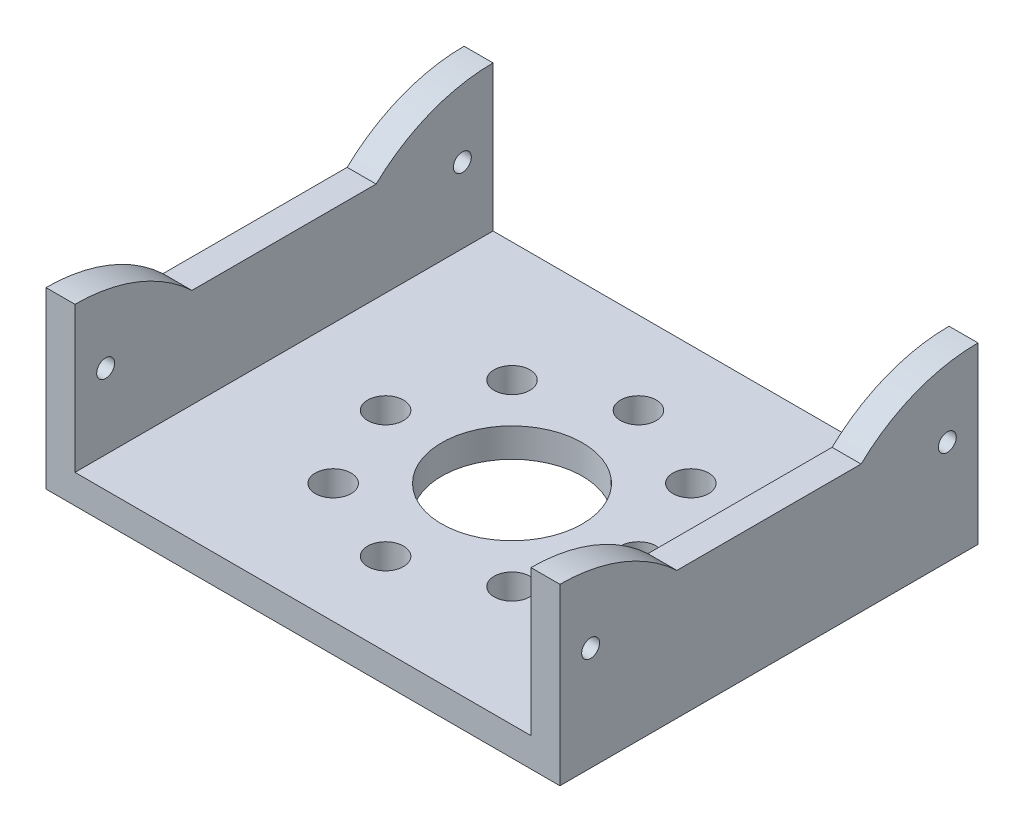
ISO-10303-21;
HEADER;
FILE_DESCRIPTION(('STEP AP214'),'2;1');
FILE_NAME('part.step','',(''),(''),'','','');
FILE_SCHEMA(('AUTOMOTIVE_DESIGN { 1 0 10303 214 1 1 1 1 }'));
ENDSEC;
DATA;
#1=APPLICATION_CONTEXT('core data for automotive mechanical design processes');
#2=APPLICATION_PROTOCOL_DEFINITION('international standard','automotive_design',2000,#1);
#3=PRODUCT_CONTEXT('',#1,'mechanical');
#4=PRODUCT('Part','Part','',(#3));
#5=PRODUCT_RELATED_PRODUCT_CATEGORY('part','',(#4));
#6=PRODUCT_DEFINITION_FORMATION('','',#4);
#7=PRODUCT_DEFINITION_CONTEXT('part definition',#1,'design');
#8=PRODUCT_DEFINITION('design','',#6,#7);
#9=PRODUCT_DEFINITION_SHAPE('','',#8);
#10=(LENGTH_UNIT() NAMED_UNIT(*) SI_UNIT(.MILLI.,.METRE.));
#11=(NAMED_UNIT(*) PLANE_ANGLE_UNIT() SI_UNIT($,.RADIAN.));
#12=(NAMED_UNIT(*) SI_UNIT($,.STERADIAN.) SOLID_ANGLE_UNIT());
#13=UNCERTAINTY_MEASURE_WITH_UNIT(LENGTH_MEASURE(1.E-05),#10,'distance_accuracy_value','');
#14=(GEOMETRIC_REPRESENTATION_CONTEXT(3) GLOBAL_UNCERTAINTY_ASSIGNED_CONTEXT((#13)) GLOBAL_UNIT_ASSIGNED_CONTEXT((#10,
#11,#12)) REPRESENTATION_CONTEXT('',''));
#15=CARTESIAN_POINT('',(0.,0.,0.));
#16=DIRECTION('',(0.,0.,1.));
#17=DIRECTION('',(1.,0.,0.));
#18=AXIS2_PLACEMENT_3D('',#15,#16,#17);
#19=CARTESIAN_POINT('',(14.37,0.,23.38));
#20=DIRECTION('',(1.,0.,0.));
#21=DIRECTION('',(0.,0.,-1.));
#22=AXIS2_PLACEMENT_3D('',#19,#20,#21);
#23=PLANE('',#22);
#24=CARTESIAN_POINT('',(14.37,5.81,1.715));
#25=DIRECTION('',(-1.,0.,0.));
#26=DIRECTION('',(0.,0.,1.));
#27=AXIS2_PLACEMENT_3D('',#24,#25,#26);
#28=CIRCLE('',#27,0.499999999999999);
#29=CARTESIAN_POINT('',(14.37,5.81,2.215));
#30=VERTEX_POINT('',#29);
#31=EDGE_CURVE('E267',#30,#30,#28,.T.);
#32=ORIENTED_EDGE('',*,*,#31,.T.);
#33=EDGE_LOOP('',(#32));
#34=FACE_BOUND('',#33,.T.);
#35=CARTESIAN_POINT('',(14.37,5.81,21.665));
#36=DIRECTION('',(-1.,0.,0.));
#37=DIRECTION('',(0.,0.,1.));
#38=AXIS2_PLACEMENT_3D('',#35,#36,#37);
#39=CIRCLE('',#38,0.499999999999992);
#40=CARTESIAN_POINT('',(14.37,5.81,22.165));
#41=VERTEX_POINT('',#40);
#42=EDGE_CURVE('E268',#41,#41,#39,.T.);
#43=ORIENTED_EDGE('',*,*,#42,.T.);
#44=EDGE_LOOP('',(#43));
#45=FACE_BOUND('',#44,.T.);
#46=DIRECTION('',(0.,-1.,0.));
#47=VECTOR('',#46,1.);
#48=CARTESIAN_POINT('',(14.37,0.,0.));
#49=LINE('',#48,#47);
#50=CARTESIAN_POINT('',(14.37,9.76,0.));
#51=VERTEX_POINT('',#50);
#52=CARTESIAN_POINT('',(14.37,0.,0.));
#53=VERTEX_POINT('',#52);
#54=EDGE_CURVE('E102',#51,#53,#49,.T.);
#55=ORIENTED_EDGE('',*,*,#54,.F.);
#56=CARTESIAN_POINT('',(14.37,0.225350969005863,0.));
#57=DIRECTION('',(1.,0.,0.));
#58=DIRECTION('',(0.,0.,-1.));
#59=AXIS2_PLACEMENT_3D('',#56,#57,#58);
#60=CIRCLE('',#59,9.53464903099414);
#61=CARTESIAN_POINT('',(14.37,7.16355586148349,6.5399422791212));
#62=VERTEX_POINT('',#61);
#63=EDGE_CURVE('E254',#51,#62,#60,.T.);
#64=ORIENTED_EDGE('',*,*,#63,.T.);
#65=DIRECTION('',(0.,0.,1.));
#66=VECTOR('',#65,1.);
#67=CARTESIAN_POINT('',(14.37,7.16355586148349,6.5399422791212));
#68=LINE('',#67,#66);
#69=CARTESIAN_POINT('',(14.37,7.16355586148349,16.8400577208788));
#70=VERTEX_POINT('',#69);
#71=EDGE_CURVE('E133',#62,#70,#68,.T.);
#72=ORIENTED_EDGE('',*,*,#71,.T.);
#73=CARTESIAN_POINT('',(14.37,0.225350969005868,23.38));
#74=DIRECTION('',(1.,0.,0.));
#75=DIRECTION('',(0.,0.,-1.));
#76=AXIS2_PLACEMENT_3D('',#73,#74,#75);
#77=CIRCLE('',#76,9.53464903099413);
#78=CARTESIAN_POINT('',(14.37,9.76,23.38));
#79=VERTEX_POINT('',#78);
#80=EDGE_CURVE('E257',#70,#79,#77,.T.);
#81=ORIENTED_EDGE('',*,*,#80,.T.);
#82=DIRECTION('',(0.,-1.,0.));
#83=VECTOR('',#82,1.);
#84=CARTESIAN_POINT('',(14.37,0.,23.38));
#85=LINE('',#84,#83);
#86=CARTESIAN_POINT('',(14.37,0.,23.38));
#87=VERTEX_POINT('',#86);
#88=EDGE_CURVE('E144',#79,#87,#85,.T.);
#89=ORIENTED_EDGE('',*,*,#88,.T.);
#90=DIRECTION('',(0.,0.,-1.));
#91=VECTOR('',#90,1.);
#92=CARTESIAN_POINT('',(14.37,0.,23.38));
#93=LINE('',#92,#91);
#94=EDGE_CURVE('E158',#87,#53,#93,.T.);
#95=ORIENTED_EDGE('',*,*,#94,.T.);
#96=EDGE_LOOP('',(#55,#64,#72,#81,#89,#95));
#97=FACE_BOUND('',#96,.T.);
#98=ADVANCED_FACE('F32',(#34,#45,#97),#23,.T.);
#99=CARTESIAN_POINT('',(12.75,9.76,23.38));
#100=DIRECTION('',(-1.,0.,0.));
#101=DIRECTION('',(0.,-1.,0.));
#102=AXIS2_PLACEMENT_3D('',#99,#100,#101);
#103=PLANE('',#102);
#104=CARTESIAN_POINT('',(12.75,5.81,1.715));
#105=DIRECTION('',(-1.,0.,0.));
#106=DIRECTION('',(0.,-1.,0.));
#107=AXIS2_PLACEMENT_3D('',#104,#105,#106);
#108=CIRCLE('',#107,0.499999999999999);
#109=CARTESIAN_POINT('',(12.75,5.31,1.715));
#110=VERTEX_POINT('',#109);
#111=EDGE_CURVE('E258',#110,#110,#108,.F.);
#112=ORIENTED_EDGE('',*,*,#111,.T.);
#113=EDGE_LOOP('',(#112));
#114=FACE_BOUND('',#113,.T.);
#115=CARTESIAN_POINT('',(12.75,5.81,21.665));
#116=DIRECTION('',(-1.,0.,0.));
#117=DIRECTION('',(0.,-1.,0.));
#118=AXIS2_PLACEMENT_3D('',#115,#116,#117);
#119=CIRCLE('',#118,0.499999999999992);
#120=CARTESIAN_POINT('',(12.75,5.31,21.665));
#121=VERTEX_POINT('',#120);
#122=EDGE_CURVE('E264',#121,#121,#119,.F.);
#123=ORIENTED_EDGE('',*,*,#122,.T.);
#124=EDGE_LOOP('',(#123));
#125=FACE_BOUND('',#124,.T.);
#126=DIRECTION('',(0.,0.,-1.));
#127=VECTOR('',#126,1.);
#128=CARTESIAN_POINT('',(12.75,7.16355586148349,23.38));
#129=LINE('',#128,#127);
#130=CARTESIAN_POINT('',(12.75,7.16355586148349,16.8400577208788));
#131=VERTEX_POINT('',#130);
#132=CARTESIAN_POINT('',(12.75,7.16355586148349,6.5399422791212));
#133=VERTEX_POINT('',#132);
#134=EDGE_CURVE('E40',#131,#133,#129,.T.);
#135=ORIENTED_EDGE('',*,*,#134,.T.);
#136=CARTESIAN_POINT('',(12.75,0.225350969005863,0.));
#137=DIRECTION('',(-1.,0.,0.));
#138=DIRECTION('',(0.,-1.,0.));
#139=AXIS2_PLACEMENT_3D('',#136,#137,#138);
#140=CIRCLE('',#139,9.53464903099414);
#141=CARTESIAN_POINT('',(12.75,9.76,0.));
#142=VERTEX_POINT('',#141);
#143=EDGE_CURVE('E11',#133,#142,#140,.T.);
#144=ORIENTED_EDGE('',*,*,#143,.T.);
#145=DIRECTION('',(0.,1.,0.));
#146=VECTOR('',#145,1.);
#147=CARTESIAN_POINT('',(12.75,9.76,0.));
#148=LINE('',#147,#146);
#149=CARTESIAN_POINT('',(12.75,1.62,0.));
#150=VERTEX_POINT('',#149);
#151=EDGE_CURVE('E148',#150,#142,#148,.T.);
#152=ORIENTED_EDGE('',*,*,#151,.F.);
#153=DIRECTION('',(0.,0.,-1.));
#154=VECTOR('',#153,1.);
#155=CARTESIAN_POINT('',(12.75,1.62,23.38));
#156=LINE('',#155,#154);
#157=CARTESIAN_POINT('',(12.75,1.62,23.38));
#158=VERTEX_POINT('',#157);
#159=EDGE_CURVE('E152',#158,#150,#156,.T.);
#160=ORIENTED_EDGE('',*,*,#159,.F.);
#161=DIRECTION('',(0.,1.,0.));
#162=VECTOR('',#161,1.);
#163=CARTESIAN_POINT('',(12.75,9.76,23.38));
#164=LINE('',#163,#162);
#165=CARTESIAN_POINT('',(12.75,9.76,23.38));
#166=VERTEX_POINT('',#165);
#167=EDGE_CURVE('E151',#158,#166,#164,.T.);
#168=ORIENTED_EDGE('',*,*,#167,.T.);
#169=CARTESIAN_POINT('',(12.75,0.225350969005868,23.38));
#170=DIRECTION('',(-1.,0.,0.));
#171=DIRECTION('',(0.,-1.,0.));
#172=AXIS2_PLACEMENT_3D('',#169,#170,#171);
#173=CIRCLE('',#172,9.53464903099413);
#174=EDGE_CURVE('E111',#166,#131,#173,.T.);
#175=ORIENTED_EDGE('',*,*,#174,.T.);
#176=EDGE_LOOP('',(#135,#144,#152,#160,#168,#175));
#177=FACE_BOUND('',#176,.T.);
#178=ADVANCED_FACE('F116',(#114,#125,#177),#103,.T.);
#179=CARTESIAN_POINT('',(-12.75,1.62,23.38));
#180=DIRECTION('',(0.,-1.,0.));
#181=DIRECTION('',(1.,0.,0.));
#182=AXIS2_PLACEMENT_3D('',#179,#180,#181);
#183=PLANE('',#182);
#184=CARTESIAN_POINT('',(-4.9999999999999,1.62,16.69));
#185=DIRECTION('',(0.,-1.,0.));
#186=DIRECTION('',(1.,0.,0.));
#187=AXIS2_PLACEMENT_3D('',#184,#185,#186);
#188=CIRCLE('',#187,1.);
#189=CARTESIAN_POINT('',(-3.9999999999999,1.62,16.69));
#190=VERTEX_POINT('',#189);
#191=EDGE_CURVE('E279',#190,#190,#188,.F.);
#192=ORIENTED_EDGE('',*,*,#191,.F.);
#193=EDGE_LOOP('',(#192));
#194=FACE_BOUND('',#193,.T.);
#195=CARTESIAN_POINT('',(5.0000000000001,1.62,16.69));
#196=DIRECTION('',(0.,-1.,0.));
#197=DIRECTION('',(1.,0.,0.));
#198=AXIS2_PLACEMENT_3D('',#195,#196,#197);
#199=CIRCLE('',#198,1.);
#200=CARTESIAN_POINT('',(6.0000000000001,1.62,16.69));
#201=VERTEX_POINT('',#200);
#202=EDGE_CURVE('E282',#201,#201,#199,.F.);
#203=ORIENTED_EDGE('',*,*,#202,.F.);
#204=EDGE_LOOP('',(#203));
#205=FACE_BOUND('',#204,.T.);
#206=CARTESIAN_POINT('',(1.0495140547435E-13,1.62,11.69));
#207=DIRECTION('',(0.,-1.,0.));
#208=DIRECTION('',(1.,0.,0.));
#209=AXIS2_PLACEMENT_3D('',#206,#207,#208);
#210=CIRCLE('',#209,3.935);
#211=CARTESIAN_POINT('',(3.93500000000011,1.62,11.69));
#212=VERTEX_POINT('',#211);
#213=EDGE_CURVE('E285',#212,#212,#210,.F.);
#214=ORIENTED_EDGE('',*,*,#213,.F.);
#215=EDGE_LOOP('',(#214));
#216=FACE_BOUND('',#215,.T.);
#217=CARTESIAN_POINT('',(1.0495140547435E-13,1.62,4.61893218813446));
#218=DIRECTION('',(0.,-1.,0.));
#219=DIRECTION('',(1.,0.,0.));
#220=AXIS2_PLACEMENT_3D('',#217,#218,#219);
#221=CIRCLE('',#220,1.);
#222=CARTESIAN_POINT('',(1.00000000000011,1.62,4.61893218813446));
#223=VERTEX_POINT('',#222);
#224=EDGE_CURVE('E288',#223,#223,#221,.F.);
#225=ORIENTED_EDGE('',*,*,#224,.F.);
#226=EDGE_LOOP('',(#225));
#227=FACE_BOUND('',#226,.T.);
#228=CARTESIAN_POINT('',(-5.,1.62,6.69000000000002));
#229=DIRECTION('',(0.,-1.,0.));
#230=DIRECTION('',(1.,0.,0.));
#231=AXIS2_PLACEMENT_3D('',#228,#229,#230);
#232=CIRCLE('',#231,1.);
#233=CARTESIAN_POINT('',(-4.,1.62,6.69000000000002));
#234=VERTEX_POINT('',#233);
#235=EDGE_CURVE('E291',#234,#234,#232,.F.);
#236=ORIENTED_EDGE('',*,*,#235,.F.);
#237=EDGE_LOOP('',(#236));
#238=FACE_BOUND('',#237,.T.);
#239=CARTESIAN_POINT('',(5.,1.62,6.69000000000001));
#240=DIRECTION('',(0.,-1.,0.));
#241=DIRECTION('',(1.,0.,0.));
#242=AXIS2_PLACEMENT_3D('',#239,#240,#241);
#243=CIRCLE('',#242,1.);
#244=CARTESIAN_POINT('',(6.,1.62,6.69000000000001));
#245=VERTEX_POINT('',#244);
#246=EDGE_CURVE('E294',#245,#245,#243,.F.);
#247=ORIENTED_EDGE('',*,*,#246,.F.);
#248=EDGE_LOOP('',(#247));
#249=FACE_BOUND('',#248,.T.);
#250=CARTESIAN_POINT('',(1.0495140547435E-13,1.62,18.7610678118655));
#251=DIRECTION('',(0.,-1.,0.));
#252=DIRECTION('',(1.,0.,0.));
#253=AXIS2_PLACEMENT_3D('',#250,#251,#252);
#254=CIRCLE('',#253,1.);
#255=CARTESIAN_POINT('',(1.00000000000011,1.62,18.7610678118655));
#256=VERTEX_POINT('',#255);
#257=EDGE_CURVE('E297',#256,#256,#254,.F.);
#258=ORIENTED_EDGE('',*,*,#257,.F.);
#259=EDGE_LOOP('',(#258));
#260=FACE_BOUND('',#259,.T.);
#261=CARTESIAN_POINT('',(7.07106781186564,1.62,11.69));
#262=DIRECTION('',(0.,-1.,0.));
#263=DIRECTION('',(1.,0.,0.));
#264=AXIS2_PLACEMENT_3D('',#261,#262,#263);
#265=CIRCLE('',#264,1.);
#266=CARTESIAN_POINT('',(8.07106781186565,1.62,11.69));
#267=VERTEX_POINT('',#266);
#268=EDGE_CURVE('E300',#267,#267,#265,.F.);
#269=ORIENTED_EDGE('',*,*,#268,.F.);
#270=EDGE_LOOP('',(#269));
#271=FACE_BOUND('',#270,.T.);
#272=CARTESIAN_POINT('',(-7.07106781186543,1.62,11.69));
#273=DIRECTION('',(0.,-1.,0.));
#274=DIRECTION('',(1.,0.,0.));
#275=AXIS2_PLACEMENT_3D('',#272,#273,#274);
#276=CIRCLE('',#275,1.);
#277=CARTESIAN_POINT('',(-6.07106781186543,1.62,11.69));
#278=VERTEX_POINT('',#277);
#279=EDGE_CURVE('E271',#278,#278,#276,.F.);
#280=ORIENTED_EDGE('',*,*,#279,.F.);
#281=EDGE_LOOP('',(#280));
#282=FACE_BOUND('',#281,.T.);
#283=DIRECTION('',(-1.,0.,0.));
#284=VECTOR('',#283,1.);
#285=CARTESIAN_POINT('',(-12.75,1.62,0.));
#286=LINE('',#285,#284);
#287=CARTESIAN_POINT('',(-12.75,1.62,0.));
#288=VERTEX_POINT('',#287);
#289=EDGE_CURVE('E193',#150,#288,#286,.T.);
#290=ORIENTED_EDGE('',*,*,#289,.T.);
#291=DIRECTION('',(0.,0.,-1.));
#292=VECTOR('',#291,1.);
#293=CARTESIAN_POINT('',(-12.75,1.62,23.38));
#294=LINE('',#293,#292);
#295=CARTESIAN_POINT('',(-12.75,1.62,23.38));
#296=VERTEX_POINT('',#295);
#297=EDGE_CURVE('E95',#296,#288,#294,.T.);
#298=ORIENTED_EDGE('',*,*,#297,.F.);
#299=DIRECTION('',(-1.,0.,0.));
#300=VECTOR('',#299,1.);
#301=CARTESIAN_POINT('',(-12.75,1.62,23.38));
#302=LINE('',#301,#300);
#303=EDGE_CURVE('E103',#158,#296,#302,.T.);
#304=ORIENTED_EDGE('',*,*,#303,.F.);
#305=ORIENTED_EDGE('',*,*,#159,.T.);
#306=EDGE_LOOP('',(#290,#298,#304,#305));
#307=FACE_BOUND('',#306,.T.);
#308=ADVANCED_FACE('F34',(#194,#205,#216,#227,#238,#249,#260,#271,#282,#307),#183,.F.);
#309=CARTESIAN_POINT('',(-12.75,9.76,23.38));
#310=DIRECTION('',(-1.,0.,0.));
#311=DIRECTION('',(0.,-1.,0.));
#312=AXIS2_PLACEMENT_3D('',#309,#310,#311);
#313=PLANE('',#312);
#314=CARTESIAN_POINT('',(-12.75,5.81,1.715));
#315=DIRECTION('',(-1.,0.,0.));
#316=DIRECTION('',(0.,-1.,0.));
#317=AXIS2_PLACEMENT_3D('',#314,#315,#316);
#318=CIRCLE('',#317,0.499999999999999);
#319=CARTESIAN_POINT('',(-12.75,5.31,1.715));
#320=VERTEX_POINT('',#319);
#321=EDGE_CURVE('E169',#320,#320,#318,.T.);
#322=ORIENTED_EDGE('',*,*,#321,.T.);
#323=EDGE_LOOP('',(#322));
#324=FACE_BOUND('',#323,.T.);
#325=CARTESIAN_POINT('',(-12.75,5.81,21.665));
#326=DIRECTION('',(-1.,0.,0.));
#327=DIRECTION('',(0.,-1.,0.));
#328=AXIS2_PLACEMENT_3D('',#325,#326,#327);
#329=CIRCLE('',#328,0.499999999999992);
#330=CARTESIAN_POINT('',(-12.75,5.31,21.665));
#331=VERTEX_POINT('',#330);
#332=EDGE_CURVE('E164',#331,#331,#329,.T.);
#333=ORIENTED_EDGE('',*,*,#332,.T.);
#334=EDGE_LOOP('',(#333));
#335=FACE_BOUND('',#334,.T.);
#336=DIRECTION('',(0.,1.,0.));
#337=VECTOR('',#336,1.);
#338=CARTESIAN_POINT('',(-12.75,9.76,0.));
#339=LINE('',#338,#337);
#340=CARTESIAN_POINT('',(-12.75,9.76,0.));
#341=VERTEX_POINT('',#340);
#342=EDGE_CURVE('E202',#288,#341,#339,.T.);
#343=ORIENTED_EDGE('',*,*,#342,.T.);
#344=CARTESIAN_POINT('',(-12.75,0.225350969005863,0.));
#345=DIRECTION('',(-1.,0.,0.));
#346=DIRECTION('',(0.,-1.,0.));
#347=AXIS2_PLACEMENT_3D('',#344,#345,#346);
#348=CIRCLE('',#347,9.53464903099414);
#349=CARTESIAN_POINT('',(-12.75,7.16355586148349,6.5399422791212));
#350=VERTEX_POINT('',#349);
#351=EDGE_CURVE('E183',#341,#350,#348,.F.);
#352=ORIENTED_EDGE('',*,*,#351,.T.);
#353=DIRECTION('',(0.,0.,1.));
#354=VECTOR('',#353,1.);
#355=CARTESIAN_POINT('',(-12.75,7.16355586148349,23.38));
#356=LINE('',#355,#354);
#357=CARTESIAN_POINT('',(-12.75,7.16355586148349,16.8400577208788));
#358=VERTEX_POINT('',#357);
#359=EDGE_CURVE('E191',#350,#358,#356,.T.);
#360=ORIENTED_EDGE('',*,*,#359,.T.);
#361=CARTESIAN_POINT('',(-12.75,0.225350969005868,23.38));
#362=DIRECTION('',(-1.,0.,0.));
#363=DIRECTION('',(0.,-1.,0.));
#364=AXIS2_PLACEMENT_3D('',#361,#362,#363);
#365=CIRCLE('',#364,9.53464903099413);
#366=CARTESIAN_POINT('',(-12.75,9.76,23.38));
#367=VERTEX_POINT('',#366);
#368=EDGE_CURVE('E188',#358,#367,#365,.F.);
#369=ORIENTED_EDGE('',*,*,#368,.T.);
#370=DIRECTION('',(0.,1.,0.));
#371=VECTOR('',#370,1.);
#372=CARTESIAN_POINT('',(-12.75,9.76,23.38));
#373=LINE('',#372,#371);
#374=EDGE_CURVE('E105',#296,#367,#373,.T.);
#375=ORIENTED_EDGE('',*,*,#374,.F.);
#376=ORIENTED_EDGE('',*,*,#297,.T.);
#377=EDGE_LOOP('',(#343,#352,#360,#369,#375,#376));
#378=FACE_BOUND('',#377,.T.);
#379=ADVANCED_FACE('F215',(#324,#335,#378),#313,.F.);
#380=CARTESIAN_POINT('',(-14.37,0.,23.38));
#381=DIRECTION('',(1.,0.,0.));
#382=DIRECTION('',(0.,0.,-1.));
#383=AXIS2_PLACEMENT_3D('',#380,#381,#382);
#384=PLANE('',#383);
#385=CARTESIAN_POINT('',(-14.37,5.81,1.715));
#386=DIRECTION('',(-1.,0.,0.));
#387=DIRECTION('',(0.,0.,1.));
#388=AXIS2_PLACEMENT_3D('',#385,#386,#387);
#389=CIRCLE('',#388,0.499999999999999);
#390=CARTESIAN_POINT('',(-14.37,5.81,2.215));
#391=VERTEX_POINT('',#390);
#392=EDGE_CURVE('E161',#391,#391,#389,.T.);
#393=ORIENTED_EDGE('',*,*,#392,.F.);
#394=EDGE_LOOP('',(#393));
#395=FACE_BOUND('',#394,.T.);
#396=CARTESIAN_POINT('',(-14.37,5.81,21.665));
#397=DIRECTION('',(-1.,0.,0.));
#398=DIRECTION('',(0.,0.,1.));
#399=AXIS2_PLACEMENT_3D('',#396,#397,#398);
#400=CIRCLE('',#399,0.499999999999992);
#401=CARTESIAN_POINT('',(-14.37,5.81,22.165));
#402=VERTEX_POINT('',#401);
#403=EDGE_CURVE('E160',#402,#402,#400,.T.);
#404=ORIENTED_EDGE('',*,*,#403,.F.);
#405=EDGE_LOOP('',(#404));
#406=FACE_BOUND('',#405,.T.);
#407=DIRECTION('',(0.,0.,1.));
#408=VECTOR('',#407,1.);
#409=CARTESIAN_POINT('',(-14.37,7.16355586148349,6.5399422791212));
#410=LINE('',#409,#408);
#411=CARTESIAN_POINT('',(-14.37,7.16355586148349,6.5399422791212));
#412=VERTEX_POINT('',#411);
#413=CARTESIAN_POINT('',(-14.37,7.16355586148349,16.8400577208788));
#414=VERTEX_POINT('',#413);
#415=EDGE_CURVE('E173',#412,#414,#410,.T.);
#416=ORIENTED_EDGE('',*,*,#415,.F.);
#417=CARTESIAN_POINT('',(-14.37,0.225350969005863,0.));
#418=DIRECTION('',(1.,0.,0.));
#419=DIRECTION('',(0.,0.,-1.));
#420=AXIS2_PLACEMENT_3D('',#417,#418,#419);
#421=CIRCLE('',#420,9.53464903099414);
#422=CARTESIAN_POINT('',(-14.37,9.76,0.));
#423=VERTEX_POINT('',#422);
#424=EDGE_CURVE('E81',#423,#412,#421,.T.);
#425=ORIENTED_EDGE('',*,*,#424,.F.);
#426=DIRECTION('',(0.,-1.,0.));
#427=VECTOR('',#426,1.);
#428=CARTESIAN_POINT('',(-14.37,0.,0.));
#429=LINE('',#428,#427);
#430=CARTESIAN_POINT('',(-14.37,0.,0.));
#431=VERTEX_POINT('',#430);
#432=EDGE_CURVE('E73',#423,#431,#429,.T.);
#433=ORIENTED_EDGE('',*,*,#432,.T.);
#434=DIRECTION('',(0.,0.,-1.));
#435=VECTOR('',#434,1.);
#436=CARTESIAN_POINT('',(-14.37,0.,23.38));
#437=LINE('',#436,#435);
#438=CARTESIAN_POINT('',(-14.37,0.,23.38));
#439=VERTEX_POINT('',#438);
#440=EDGE_CURVE('E77',#439,#431,#437,.T.);
#441=ORIENTED_EDGE('',*,*,#440,.F.);
#442=DIRECTION('',(0.,-1.,0.));
#443=VECTOR('',#442,1.);
#444=CARTESIAN_POINT('',(-14.37,0.,23.38));
#445=LINE('',#444,#443);
#446=CARTESIAN_POINT('',(-14.37,9.76,23.38));
#447=VERTEX_POINT('',#446);
#448=EDGE_CURVE('E56',#447,#439,#445,.T.);
#449=ORIENTED_EDGE('',*,*,#448,.F.);
#450=CARTESIAN_POINT('',(-14.37,0.225350969005868,23.38));
#451=DIRECTION('',(1.,0.,0.));
#452=DIRECTION('',(0.,0.,-1.));
#453=AXIS2_PLACEMENT_3D('',#450,#451,#452);
#454=CIRCLE('',#453,9.53464903099413);
#455=EDGE_CURVE('E176',#414,#447,#454,.T.);
#456=ORIENTED_EDGE('',*,*,#455,.F.);
#457=EDGE_LOOP('',(#416,#425,#433,#441,#449,#456));
#458=FACE_BOUND('',#457,.T.);
#459=ADVANCED_FACE('F76',(#395,#406,#458),#384,.F.);
#460=CARTESIAN_POINT('',(0.,0.,23.38));
#461=DIRECTION('',(0.,1.,0.));
#462=DIRECTION('',(-1.,0.,0.));
#463=AXIS2_PLACEMENT_3D('',#460,#461,#462);
#464=PLANE('',#463);
#465=CARTESIAN_POINT('',(-4.9999999999999,0.,16.69));
#466=DIRECTION('',(0.,1.,0.));
#467=DIRECTION('',(0.,0.,1.));
#468=AXIS2_PLACEMENT_3D('',#465,#466,#467);
#469=CIRCLE('',#468,1.);
#470=CARTESIAN_POINT('',(-4.9999999999999,0.,17.69));
#471=VERTEX_POINT('',#470);
#472=EDGE_CURVE('E316',#471,#471,#469,.T.);
#473=ORIENTED_EDGE('',*,*,#472,.T.);
#474=EDGE_LOOP('',(#473));
#475=FACE_BOUND('',#474,.T.);
#476=CARTESIAN_POINT('',(5.0000000000001,0.,16.69));
#477=DIRECTION('',(0.,1.,0.));
#478=DIRECTION('',(0.,0.,1.));
#479=AXIS2_PLACEMENT_3D('',#476,#477,#478);
#480=CIRCLE('',#479,1.);
#481=CARTESIAN_POINT('',(5.0000000000001,0.,17.69));
#482=VERTEX_POINT('',#481);
#483=EDGE_CURVE('E319',#482,#482,#480,.T.);
#484=ORIENTED_EDGE('',*,*,#483,.T.);
#485=EDGE_LOOP('',(#484));
#486=FACE_BOUND('',#485,.T.);
#487=CARTESIAN_POINT('',(1.0495140547435E-13,0.,11.69));
#488=DIRECTION('',(0.,1.,0.));
#489=DIRECTION('',(0.,0.,1.));
#490=AXIS2_PLACEMENT_3D('',#487,#488,#489);
#491=CIRCLE('',#490,3.935);
#492=CARTESIAN_POINT('',(1.0495140547435E-13,0.,15.625));
#493=VERTEX_POINT('',#492);
#494=EDGE_CURVE('E322',#493,#493,#491,.T.);
#495=ORIENTED_EDGE('',*,*,#494,.T.);
#496=EDGE_LOOP('',(#495));
#497=FACE_BOUND('',#496,.T.);
#498=CARTESIAN_POINT('',(1.0495140547435E-13,0.,4.61893218813446));
#499=DIRECTION('',(0.,1.,0.));
#500=DIRECTION('',(0.,0.,1.));
#501=AXIS2_PLACEMENT_3D('',#498,#499,#500);
#502=CIRCLE('',#501,1.);
#503=CARTESIAN_POINT('',(1.0495140547435E-13,0.,5.61893218813446));
#504=VERTEX_POINT('',#503);
#505=EDGE_CURVE('E308',#504,#504,#502,.T.);
#506=ORIENTED_EDGE('',*,*,#505,.T.);
#507=EDGE_LOOP('',(#506));
#508=FACE_BOUND('',#507,.T.);
#509=CARTESIAN_POINT('',(-5.,0.,6.69000000000002));
#510=DIRECTION('',(0.,1.,0.));
#511=DIRECTION('',(0.,0.,1.));
#512=AXIS2_PLACEMENT_3D('',#509,#510,#511);
#513=CIRCLE('',#512,1.);
#514=CARTESIAN_POINT('',(-5.,0.,7.69000000000002));
#515=VERTEX_POINT('',#514);
#516=EDGE_CURVE('E304',#515,#515,#513,.T.);
#517=ORIENTED_EDGE('',*,*,#516,.T.);
#518=EDGE_LOOP('',(#517));
#519=FACE_BOUND('',#518,.T.);
#520=CARTESIAN_POINT('',(5.,0.,6.69000000000001));
#521=DIRECTION('',(0.,1.,0.));
#522=DIRECTION('',(0.,0.,1.));
#523=AXIS2_PLACEMENT_3D('',#520,#521,#522);
#524=CIRCLE('',#523,1.);
#525=CARTESIAN_POINT('',(5.,0.,7.69000000000001));
#526=VERTEX_POINT('',#525);
#527=EDGE_CURVE('E307',#526,#526,#524,.T.);
#528=ORIENTED_EDGE('',*,*,#527,.T.);
#529=EDGE_LOOP('',(#528));
#530=FACE_BOUND('',#529,.T.);
#531=CARTESIAN_POINT('',(1.0495140547435E-13,0.,18.7610678118655));
#532=DIRECTION('',(0.,1.,0.));
#533=DIRECTION('',(0.,0.,1.));
#534=AXIS2_PLACEMENT_3D('',#531,#532,#533);
#535=CIRCLE('',#534,1.);
#536=CARTESIAN_POINT('',(1.0495140547435E-13,0.,19.7610678118655));
#537=VERTEX_POINT('',#536);
#538=EDGE_CURVE('E311',#537,#537,#535,.T.);
#539=ORIENTED_EDGE('',*,*,#538,.T.);
#540=EDGE_LOOP('',(#539));
#541=FACE_BOUND('',#540,.T.);
#542=CARTESIAN_POINT('',(7.07106781186564,0.,11.69));
#543=DIRECTION('',(0.,1.,0.));
#544=DIRECTION('',(0.,0.,1.));
#545=AXIS2_PLACEMENT_3D('',#542,#543,#544);
#546=CIRCLE('',#545,1.);
#547=CARTESIAN_POINT('',(7.07106781186564,0.,12.69));
#548=VERTEX_POINT('',#547);
#549=EDGE_CURVE('E303',#548,#548,#546,.T.);
#550=ORIENTED_EDGE('',*,*,#549,.T.);
#551=EDGE_LOOP('',(#550));
#552=FACE_BOUND('',#551,.T.);
#553=CARTESIAN_POINT('',(-7.07106781186543,0.,11.69));
#554=DIRECTION('',(0.,1.,0.));
#555=DIRECTION('',(0.,0.,1.));
#556=AXIS2_PLACEMENT_3D('',#553,#554,#555);
#557=CIRCLE('',#556,1.);
#558=CARTESIAN_POINT('',(-7.07106781186543,0.,12.69));
#559=VERTEX_POINT('',#558);
#560=EDGE_CURVE('E276',#559,#559,#557,.T.);
#561=ORIENTED_EDGE('',*,*,#560,.T.);
#562=EDGE_LOOP('',(#561));
#563=FACE_BOUND('',#562,.T.);
#564=DIRECTION('',(1.,0.,0.));
#565=VECTOR('',#564,1.);
#566=CARTESIAN_POINT('',(0.,0.,0.));
#567=LINE('',#566,#565);
#568=EDGE_CURVE('E85',#431,#53,#567,.T.);
#569=ORIENTED_EDGE('',*,*,#568,.T.);
#570=ORIENTED_EDGE('',*,*,#94,.F.);
#571=DIRECTION('',(1.,0.,0.));
#572=VECTOR('',#571,1.);
#573=CARTESIAN_POINT('',(0.,0.,23.38));
#574=LINE('',#573,#572);
#575=EDGE_CURVE('E94',#439,#87,#574,.T.);
#576=ORIENTED_EDGE('',*,*,#575,.F.);
#577=ORIENTED_EDGE('',*,*,#440,.T.);
#578=EDGE_LOOP('',(#569,#570,#576,#577));
#579=FACE_BOUND('',#578,.T.);
#580=ADVANCED_FACE('F90',(#475,#486,#497,#508,#519,#530,#541,#552,#563,#579),#464,.F.);
#581=CARTESIAN_POINT('',(0.,0.,23.38));
#582=DIRECTION('',(0.,0.,-1.));
#583=DIRECTION('',(-1.,0.,0.));
#584=AXIS2_PLACEMENT_3D('',#581,#582,#583);
#585=PLANE('',#584);
#586=ORIENTED_EDGE('',*,*,#575,.T.);
#587=ORIENTED_EDGE('',*,*,#88,.F.);
#588=DIRECTION('',(1.,0.,0.));
#589=VECTOR('',#588,1.);
#590=CARTESIAN_POINT('',(14.37,9.76,23.38));
#591=LINE('',#590,#589);
#592=EDGE_CURVE('E147',#166,#79,#591,.T.);
#593=ORIENTED_EDGE('',*,*,#592,.F.);
#594=ORIENTED_EDGE('',*,*,#167,.F.);
#595=ORIENTED_EDGE('',*,*,#303,.T.);
#596=ORIENTED_EDGE('',*,*,#374,.T.);
#597=DIRECTION('',(-1.,0.,0.));
#598=VECTOR('',#597,1.);
#599=CARTESIAN_POINT('',(-14.37,9.76,23.38));
#600=LINE('',#599,#598);
#601=EDGE_CURVE('E197',#367,#447,#600,.T.);
#602=ORIENTED_EDGE('',*,*,#601,.T.);
#603=ORIENTED_EDGE('',*,*,#448,.T.);
#604=EDGE_LOOP('',(#586,#587,#593,#594,#595,#596,#602,#603));
#605=FACE_BOUND('',#604,.T.);
#606=ADVANCED_FACE('F246',(#605),#585,.F.);
#607=CARTESIAN_POINT('',(0.,0.,0.));
#608=DIRECTION('',(0.,0.,-1.));
#609=DIRECTION('',(-1.,0.,0.));
#610=AXIS2_PLACEMENT_3D('',#607,#608,#609);
#611=PLANE('',#610);
#612=ORIENTED_EDGE('',*,*,#289,.F.);
#613=ORIENTED_EDGE('',*,*,#151,.T.);
#614=DIRECTION('',(1.,0.,0.));
#615=VECTOR('',#614,1.);
#616=CARTESIAN_POINT('',(14.37,9.76,0.));
#617=LINE('',#616,#615);
#618=EDGE_CURVE('E138',#142,#51,#617,.T.);
#619=ORIENTED_EDGE('',*,*,#618,.T.);
#620=ORIENTED_EDGE('',*,*,#54,.T.);
#621=ORIENTED_EDGE('',*,*,#568,.F.);
#622=ORIENTED_EDGE('',*,*,#432,.F.);
#623=DIRECTION('',(-1.,0.,0.));
#624=VECTOR('',#623,1.);
#625=CARTESIAN_POINT('',(-14.37,9.76,0.));
#626=LINE('',#625,#624);
#627=EDGE_CURVE('E86',#341,#423,#626,.T.);
#628=ORIENTED_EDGE('',*,*,#627,.F.);
#629=ORIENTED_EDGE('',*,*,#342,.F.);
#630=EDGE_LOOP('',(#612,#613,#619,#620,#621,#622,#628,#629));
#631=FACE_BOUND('',#630,.T.);
#632=ADVANCED_FACE('F99',(#631),#611,.T.);
#633=CARTESIAN_POINT('',(30.13,7.16355586148349,6.5399422791212));
#634=DIRECTION('',(0.,-1.,0.));
#635=DIRECTION('',(0.,0.,-1.));
#636=AXIS2_PLACEMENT_3D('',#633,#634,#635);
#637=PLANE('',#636);
#638=DIRECTION('',(-1.,0.,0.));
#639=VECTOR('',#638,1.);
#640=CARTESIAN_POINT('',(30.13,7.16355586148349,6.5399422791212));
#641=LINE('',#640,#639);
#642=EDGE_CURVE('E179',#350,#412,#641,.T.);
#643=ORIENTED_EDGE('',*,*,#642,.T.);
#644=ORIENTED_EDGE('',*,*,#415,.T.);
#645=DIRECTION('',(-1.,0.,0.));
#646=VECTOR('',#645,1.);
#647=CARTESIAN_POINT('',(30.13,7.16355586148349,16.8400577208788));
#648=LINE('',#647,#646);
#649=EDGE_CURVE('E180',#358,#414,#648,.T.);
#650=ORIENTED_EDGE('',*,*,#649,.F.);
#651=ORIENTED_EDGE('',*,*,#359,.F.);
#652=EDGE_LOOP('',(#643,#644,#650,#651));
#653=FACE_BOUND('',#652,.T.);
#654=ADVANCED_FACE('F390',(#653),#637,.F.);
#655=CARTESIAN_POINT('',(30.13,0.225350969005868,23.38));
#656=DIRECTION('',(-1.,0.,0.));
#657=DIRECTION('',(0.,0.,1.));
#658=AXIS2_PLACEMENT_3D('',#655,#656,#657);
#659=CYLINDRICAL_SURFACE('',#658,9.53464903099413);
#660=ORIENTED_EDGE('',*,*,#649,.T.);
#661=ORIENTED_EDGE('',*,*,#455,.T.);
#662=ORIENTED_EDGE('',*,*,#601,.F.);
#663=ORIENTED_EDGE('',*,*,#368,.F.);
#664=EDGE_LOOP('',(#660,#661,#662,#663));
#665=FACE_BOUND('',#664,.T.);
#666=ADVANCED_FACE('F243',(#665),#659,.T.);
#667=CARTESIAN_POINT('',(30.13,0.225350969005863,0.));
#668=DIRECTION('',(-1.,0.,0.));
#669=DIRECTION('',(0.,0.,1.));
#670=AXIS2_PLACEMENT_3D('',#667,#668,#669);
#671=CYLINDRICAL_SURFACE('',#670,9.53464903099414);
#672=ORIENTED_EDGE('',*,*,#627,.T.);
#673=ORIENTED_EDGE('',*,*,#424,.T.);
#674=ORIENTED_EDGE('',*,*,#642,.F.);
#675=ORIENTED_EDGE('',*,*,#351,.F.);
#676=EDGE_LOOP('',(#672,#673,#674,#675));
#677=FACE_BOUND('',#676,.T.);
#678=ADVANCED_FACE('F206',(#677),#671,.T.);
#679=CARTESIAN_POINT('',(30.13,5.81,21.665));
#680=DIRECTION('',(-1.,0.,0.));
#681=DIRECTION('',(0.,0.,1.));
#682=AXIS2_PLACEMENT_3D('',#679,#680,#681);
#683=CYLINDRICAL_SURFACE('',#682,0.499999999999992);
#684=ORIENTED_EDGE('',*,*,#403,.T.);
#685=EDGE_LOOP('',(#684));
#686=FACE_BOUND('',#685,.T.);
#687=ORIENTED_EDGE('',*,*,#332,.F.);
#688=EDGE_LOOP('',(#687));
#689=FACE_BOUND('',#688,.T.);
#690=ADVANCED_FACE('F383',(#686,#689),#683,.F.);
#691=CARTESIAN_POINT('',(30.13,5.81,1.715));
#692=DIRECTION('',(-1.,0.,0.));
#693=DIRECTION('',(0.,0.,1.));
#694=AXIS2_PLACEMENT_3D('',#691,#692,#693);
#695=CYLINDRICAL_SURFACE('',#694,0.499999999999999);
#696=ORIENTED_EDGE('',*,*,#392,.T.);
#697=EDGE_LOOP('',(#696));
#698=FACE_BOUND('',#697,.T.);
#699=ORIENTED_EDGE('',*,*,#321,.F.);
#700=EDGE_LOOP('',(#699));
#701=FACE_BOUND('',#700,.T.);
#702=ADVANCED_FACE('F380',(#698,#701),#695,.F.);
#703=CARTESIAN_POINT('',(-30.13,0.225350969005863,0.));
#704=DIRECTION('',(1.,0.,0.));
#705=DIRECTION('',(0.,0.,-1.));
#706=AXIS2_PLACEMENT_3D('',#703,#704,#705);
#707=CYLINDRICAL_SURFACE('',#706,9.53464903099414);
#708=DIRECTION('',(1.,0.,0.));
#709=VECTOR('',#708,1.);
#710=CARTESIAN_POINT('',(-30.13,7.16355586148349,6.5399422791212));
#711=LINE('',#710,#709);
#712=EDGE_CURVE('E130',#133,#62,#711,.T.);
#713=ORIENTED_EDGE('',*,*,#712,.T.);
#714=ORIENTED_EDGE('',*,*,#63,.F.);
#715=ORIENTED_EDGE('',*,*,#618,.F.);
#716=ORIENTED_EDGE('',*,*,#143,.F.);
#717=EDGE_LOOP('',(#713,#714,#715,#716));
#718=FACE_BOUND('',#717,.T.);
#719=ADVANCED_FACE('F255',(#718),#707,.T.);
#720=CARTESIAN_POINT('',(-30.13,7.16355586148349,6.5399422791212));
#721=DIRECTION('',(0.,1.,0.));
#722=DIRECTION('',(0.,0.,1.));
#723=AXIS2_PLACEMENT_3D('',#720,#721,#722);
#724=PLANE('',#723);
#725=DIRECTION('',(1.,0.,0.));
#726=VECTOR('',#725,1.);
#727=CARTESIAN_POINT('',(-30.13,7.16355586148349,16.8400577208788));
#728=LINE('',#727,#726);
#729=EDGE_CURVE('E47',#131,#70,#728,.T.);
#730=ORIENTED_EDGE('',*,*,#729,.T.);
#731=ORIENTED_EDGE('',*,*,#71,.F.);
#732=ORIENTED_EDGE('',*,*,#712,.F.);
#733=ORIENTED_EDGE('',*,*,#134,.F.);
#734=EDGE_LOOP('',(#730,#731,#732,#733));
#735=FACE_BOUND('',#734,.T.);
#736=ADVANCED_FACE('F126',(#735),#724,.T.);
#737=CARTESIAN_POINT('',(-30.13,0.225350969005868,23.38));
#738=DIRECTION('',(1.,0.,0.));
#739=DIRECTION('',(0.,0.,-1.));
#740=AXIS2_PLACEMENT_3D('',#737,#738,#739);
#741=CYLINDRICAL_SURFACE('',#740,9.53464903099413);
#742=ORIENTED_EDGE('',*,*,#592,.T.);
#743=ORIENTED_EDGE('',*,*,#80,.F.);
#744=ORIENTED_EDGE('',*,*,#729,.F.);
#745=ORIENTED_EDGE('',*,*,#174,.F.);
#746=EDGE_LOOP('',(#742,#743,#744,#745));
#747=FACE_BOUND('',#746,.T.);
#748=ADVANCED_FACE('F464',(#747),#741,.T.);
#749=CARTESIAN_POINT('',(-30.13,5.81,21.665));
#750=DIRECTION('',(1.,0.,0.));
#751=DIRECTION('',(0.,0.,-1.));
#752=AXIS2_PLACEMENT_3D('',#749,#750,#751);
#753=CYLINDRICAL_SURFACE('',#752,0.499999999999992);
#754=ORIENTED_EDGE('',*,*,#122,.F.);
#755=EDGE_LOOP('',(#754));
#756=FACE_BOUND('',#755,.T.);
#757=ORIENTED_EDGE('',*,*,#42,.F.);
#758=EDGE_LOOP('',(#757));
#759=FACE_BOUND('',#758,.T.);
#760=ADVANCED_FACE('F364',(#756,#759),#753,.F.);
#761=CARTESIAN_POINT('',(-30.13,5.81,1.715));
#762=DIRECTION('',(1.,0.,0.));
#763=DIRECTION('',(0.,0.,-1.));
#764=AXIS2_PLACEMENT_3D('',#761,#762,#763);
#765=CYLINDRICAL_SURFACE('',#764,0.499999999999999);
#766=ORIENTED_EDGE('',*,*,#111,.F.);
#767=EDGE_LOOP('',(#766));
#768=FACE_BOUND('',#767,.T.);
#769=ORIENTED_EDGE('',*,*,#31,.F.);
#770=EDGE_LOOP('',(#769));
#771=FACE_BOUND('',#770,.T.);
#772=ADVANCED_FACE('F354',(#768,#771),#765,.F.);
#773=CARTESIAN_POINT('',(-7.07106781186543,20.5,11.69));
#774=DIRECTION('',(0.,-1.,0.));
#775=DIRECTION('',(0.,0.,-1.));
#776=AXIS2_PLACEMENT_3D('',#773,#774,#775);
#777=CYLINDRICAL_SURFACE('',#776,1.);
#778=ORIENTED_EDGE('',*,*,#560,.F.);
#779=EDGE_LOOP('',(#778));
#780=FACE_BOUND('',#779,.T.);
#781=ORIENTED_EDGE('',*,*,#279,.T.);
#782=EDGE_LOOP('',(#781));
#783=FACE_BOUND('',#782,.T.);
#784=ADVANCED_FACE('F351',(#780,#783),#777,.F.);
#785=CARTESIAN_POINT('',(7.07106781186564,20.5,11.69));
#786=DIRECTION('',(0.,-1.,0.));
#787=DIRECTION('',(0.,0.,-1.));
#788=AXIS2_PLACEMENT_3D('',#785,#786,#787);
#789=CYLINDRICAL_SURFACE('',#788,1.);
#790=ORIENTED_EDGE('',*,*,#549,.F.);
#791=EDGE_LOOP('',(#790));
#792=FACE_BOUND('',#791,.T.);
#793=ORIENTED_EDGE('',*,*,#268,.T.);
#794=EDGE_LOOP('',(#793));
#795=FACE_BOUND('',#794,.T.);
#796=ADVANCED_FACE('F353',(#792,#795),#789,.F.);
#797=CARTESIAN_POINT('',(1.0495140547435E-13,20.5,18.7610678118655));
#798=DIRECTION('',(0.,-1.,0.));
#799=DIRECTION('',(0.,0.,-1.));
#800=AXIS2_PLACEMENT_3D('',#797,#798,#799);
#801=CYLINDRICAL_SURFACE('',#800,1.);
#802=ORIENTED_EDGE('',*,*,#538,.F.);
#803=EDGE_LOOP('',(#802));
#804=FACE_BOUND('',#803,.T.);
#805=ORIENTED_EDGE('',*,*,#257,.T.);
#806=EDGE_LOOP('',(#805));
#807=FACE_BOUND('',#806,.T.);
#808=ADVANCED_FACE('F361',(#804,#807),#801,.F.);
#809=CARTESIAN_POINT('',(5.,20.5,6.69000000000001));
#810=DIRECTION('',(0.,-1.,0.));
#811=DIRECTION('',(0.,0.,-1.));
#812=AXIS2_PLACEMENT_3D('',#809,#810,#811);
#813=CYLINDRICAL_SURFACE('',#812,1.);
#814=ORIENTED_EDGE('',*,*,#527,.F.);
#815=EDGE_LOOP('',(#814));
#816=FACE_BOUND('',#815,.T.);
#817=ORIENTED_EDGE('',*,*,#246,.T.);
#818=EDGE_LOOP('',(#817));
#819=FACE_BOUND('',#818,.T.);
#820=ADVANCED_FACE('F554',(#816,#819),#813,.F.);
#821=CARTESIAN_POINT('',(-5.,20.5,6.69000000000002));
#822=DIRECTION('',(0.,-1.,0.));
#823=DIRECTION('',(0.,0.,-1.));
#824=AXIS2_PLACEMENT_3D('',#821,#822,#823);
#825=CYLINDRICAL_SURFACE('',#824,1.);
#826=ORIENTED_EDGE('',*,*,#516,.F.);
#827=EDGE_LOOP('',(#826));
#828=FACE_BOUND('',#827,.T.);
#829=ORIENTED_EDGE('',*,*,#235,.T.);
#830=EDGE_LOOP('',(#829));
#831=FACE_BOUND('',#830,.T.);
#832=ADVANCED_FACE('F334',(#828,#831),#825,.F.);
#833=CARTESIAN_POINT('',(1.0495140547435E-13,20.5,4.61893218813446));
#834=DIRECTION('',(0.,-1.,0.));
#835=DIRECTION('',(0.,0.,-1.));
#836=AXIS2_PLACEMENT_3D('',#833,#834,#835);
#837=CYLINDRICAL_SURFACE('',#836,1.);
#838=ORIENTED_EDGE('',*,*,#505,.F.);
#839=EDGE_LOOP('',(#838));
#840=FACE_BOUND('',#839,.T.);
#841=ORIENTED_EDGE('',*,*,#224,.T.);
#842=EDGE_LOOP('',(#841));
#843=FACE_BOUND('',#842,.T.);
#844=ADVANCED_FACE('F330',(#840,#843),#837,.F.);
#845=CARTESIAN_POINT('',(1.0495140547435E-13,20.5,11.69));
#846=DIRECTION('',(0.,-1.,0.));
#847=DIRECTION('',(0.,0.,-1.));
#848=AXIS2_PLACEMENT_3D('',#845,#846,#847);
#849=CYLINDRICAL_SURFACE('',#848,3.935);
#850=ORIENTED_EDGE('',*,*,#494,.F.);
#851=EDGE_LOOP('',(#850));
#852=FACE_BOUND('',#851,.T.);
#853=ORIENTED_EDGE('',*,*,#213,.T.);
#854=EDGE_LOOP('',(#853));
#855=FACE_BOUND('',#854,.T.);
#856=ADVANCED_FACE('F333',(#852,#855),#849,.F.);
#857=CARTESIAN_POINT('',(5.0000000000001,20.5,16.69));
#858=DIRECTION('',(0.,-1.,0.));
#859=DIRECTION('',(0.,0.,-1.));
#860=AXIS2_PLACEMENT_3D('',#857,#858,#859);
#861=CYLINDRICAL_SURFACE('',#860,1.);
#862=ORIENTED_EDGE('',*,*,#483,.F.);
#863=EDGE_LOOP('',(#862));
#864=FACE_BOUND('',#863,.T.);
#865=ORIENTED_EDGE('',*,*,#202,.T.);
#866=EDGE_LOOP('',(#865));
#867=FACE_BOUND('',#866,.T.);
#868=ADVANCED_FACE('F583',(#864,#867),#861,.F.);
#869=CARTESIAN_POINT('',(-4.9999999999999,20.5,16.69));
#870=DIRECTION('',(0.,-1.,0.));
#871=DIRECTION('',(0.,0.,-1.));
#872=AXIS2_PLACEMENT_3D('',#869,#870,#871);
#873=CYLINDRICAL_SURFACE('',#872,1.);
#874=ORIENTED_EDGE('',*,*,#472,.F.);
#875=EDGE_LOOP('',(#874));
#876=FACE_BOUND('',#875,.T.);
#877=ORIENTED_EDGE('',*,*,#191,.T.);
#878=EDGE_LOOP('',(#877));
#879=FACE_BOUND('',#878,.T.);
#880=ADVANCED_FACE('F592',(#876,#879),#873,.F.);
#881=CLOSED_SHELL('',(#98,#178,#308,#379,#459,#580,#606,#632,#654,#666,#678,#690,#702,#719,#736,
#748,#760,#772,#784,#796,#808,#820,#832,#844,#856,#868,#880));
#882=MANIFOLD_SOLID_BREP('B2',#881);
#883=ADVANCED_BREP_SHAPE_REPRESENTATION('',(#18,#882),#14);
#884=SHAPE_DEFINITION_REPRESENTATION(#9,#883);
ENDSEC;
END-ISO-10303-21;
